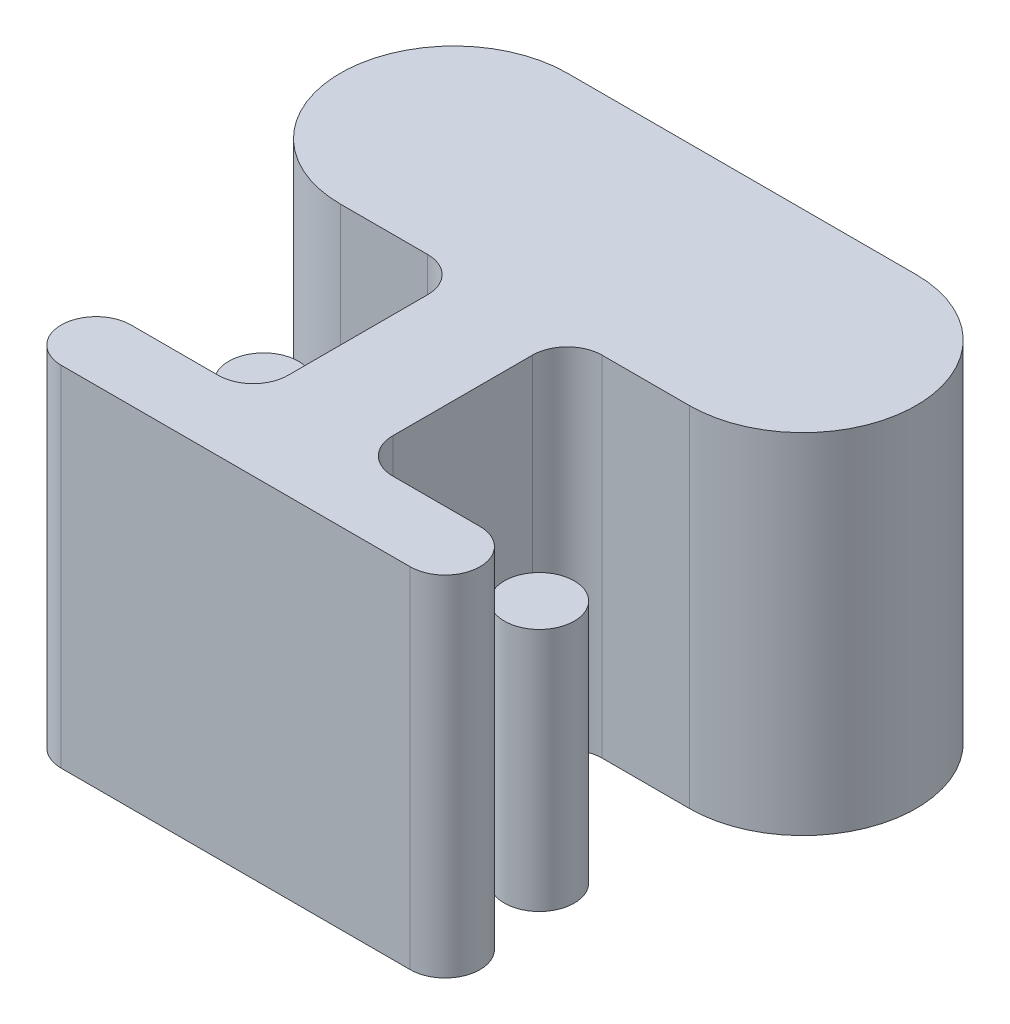
ISO-10303-21;
HEADER;
FILE_DESCRIPTION(('STEP AP214'),'2;1');
FILE_NAME('part.step','',(''),(''),'','','');
FILE_SCHEMA(('AUTOMOTIVE_DESIGN { 1 0 10303 214 1 1 1 1 }'));
ENDSEC;
DATA;
#1=APPLICATION_CONTEXT('core data for automotive mechanical design processes');
#2=APPLICATION_PROTOCOL_DEFINITION('international standard','automotive_design',2000,#1);
#3=PRODUCT_CONTEXT('',#1,'mechanical');
#4=PRODUCT('Part','Part','',(#3));
#5=PRODUCT_RELATED_PRODUCT_CATEGORY('part','',(#4));
#6=PRODUCT_DEFINITION_FORMATION('','',#4);
#7=PRODUCT_DEFINITION_CONTEXT('part definition',#1,'design');
#8=PRODUCT_DEFINITION('design','',#6,#7);
#9=PRODUCT_DEFINITION_SHAPE('','',#8);
#10=(LENGTH_UNIT() NAMED_UNIT(*) SI_UNIT(.MILLI.,.METRE.));
#11=(NAMED_UNIT(*) PLANE_ANGLE_UNIT() SI_UNIT($,.RADIAN.));
#12=(NAMED_UNIT(*) SI_UNIT($,.STERADIAN.) SOLID_ANGLE_UNIT());
#13=UNCERTAINTY_MEASURE_WITH_UNIT(LENGTH_MEASURE(1.E-05),#10,'distance_accuracy_value','');
#14=(GEOMETRIC_REPRESENTATION_CONTEXT(3) GLOBAL_UNCERTAINTY_ASSIGNED_CONTEXT((#13)) GLOBAL_UNIT_ASSIGNED_CONTEXT((#10,
#11,#12)) REPRESENTATION_CONTEXT('',''));
#15=CARTESIAN_POINT('',(0.,0.,0.));
#16=DIRECTION('',(0.,0.,1.));
#17=DIRECTION('',(1.,0.,0.));
#18=AXIS2_PLACEMENT_3D('',#15,#16,#17);
#19=CARTESIAN_POINT('',(-470.,700.,575.));
#20=DIRECTION('',(0.,-1.,0.));
#21=DIRECTION('',(0.,0.,-1.));
#22=AXIS2_PLACEMENT_3D('',#19,#20,#21);
#23=CYLINDRICAL_SURFACE('',#22,100.);
#24=CARTESIAN_POINT('',(-470.,700.,575.));
#25=DIRECTION('',(0.,-1.,0.));
#26=DIRECTION('',(0.,0.,-1.));
#27=AXIS2_PLACEMENT_3D('',#24,#25,#26);
#28=CIRCLE('',#27,100.);
#29=CARTESIAN_POINT('',(-470.,700.,475.));
#30=VERTEX_POINT('',#29);
#31=EDGE_CURVE('E53',#30,#30,#28,.T.);
#32=ORIENTED_EDGE('',*,*,#31,.T.);
#33=EDGE_LOOP('',(#32));
#34=FACE_BOUND('',#33,.T.);
#35=CARTESIAN_POINT('',(-470.,0.,575.));
#36=DIRECTION('',(0.,-1.,0.));
#37=DIRECTION('',(0.,0.,-1.));
#38=AXIS2_PLACEMENT_3D('',#35,#36,#37);
#39=CIRCLE('',#38,100.);
#40=CARTESIAN_POINT('',(-470.,0.,475.));
#41=VERTEX_POINT('',#40);
#42=EDGE_CURVE('E11',#41,#41,#39,.T.);
#43=ORIENTED_EDGE('',*,*,#42,.F.);
#44=EDGE_LOOP('',(#43));
#45=FACE_BOUND('',#44,.T.);
#46=ADVANCED_FACE('F49',(#34,#45),#23,.T.);
#47=CARTESIAN_POINT('',(-470.,700.,575.));
#48=DIRECTION('',(0.,-1.,0.));
#49=DIRECTION('',(0.,0.,-1.));
#50=AXIS2_PLACEMENT_3D('',#47,#48,#49);
#51=PLANE('',#50);
#52=ORIENTED_EDGE('',*,*,#31,.F.);
#53=EDGE_LOOP('',(#52));
#54=FACE_BOUND('',#53,.T.);
#55=ADVANCED_FACE('F51',(#54),#51,.F.);
#56=CARTESIAN_POINT('',(-470.,0.,575.));
#57=DIRECTION('',(0.,-1.,0.));
#58=DIRECTION('',(0.,0.,-1.));
#59=AXIS2_PLACEMENT_3D('',#56,#57,#58);
#60=PLANE('',#59);
#61=ORIENTED_EDGE('',*,*,#42,.T.);
#62=EDGE_LOOP('',(#61));
#63=FACE_BOUND('',#62,.T.);
#64=ADVANCED_FACE('F65',(#63),#60,.T.);
#65=CLOSED_SHELL('',(#46,#55,#64));
#66=MANIFOLD_SOLID_BREP('B2',#65);
#67=CARTESIAN_POINT('',(470.,700.,725.));
#68=DIRECTION('',(0.,-1.,0.));
#69=DIRECTION('',(0.,0.,-1.));
#70=AXIS2_PLACEMENT_3D('',#67,#68,#69);
#71=CYLINDRICAL_SURFACE('',#70,100.);
#72=CARTESIAN_POINT('',(470.,700.,725.));
#73=DIRECTION('',(0.,-1.,0.));
#74=DIRECTION('',(0.,0.,-1.));
#75=AXIS2_PLACEMENT_3D('',#72,#73,#74);
#76=CIRCLE('',#75,100.);
#77=CARTESIAN_POINT('',(470.,700.,625.));
#78=VERTEX_POINT('',#77);
#79=EDGE_CURVE('E48',#78,#78,#76,.T.);
#80=ORIENTED_EDGE('',*,*,#79,.T.);
#81=EDGE_LOOP('',(#80));
#82=FACE_BOUND('',#81,.T.);
#83=CARTESIAN_POINT('',(470.,0.,725.));
#84=DIRECTION('',(0.,-1.,0.));
#85=DIRECTION('',(0.,0.,-1.));
#86=AXIS2_PLACEMENT_3D('',#83,#84,#85);
#87=CIRCLE('',#86,100.);
#88=CARTESIAN_POINT('',(470.,0.,625.));
#89=VERTEX_POINT('',#88);
#90=EDGE_CURVE('E107',#89,#89,#87,.T.);
#91=ORIENTED_EDGE('',*,*,#90,.F.);
#92=EDGE_LOOP('',(#91));
#93=FACE_BOUND('',#92,.T.);
#94=ADVANCED_FACE('F104',(#82,#93),#71,.T.);
#95=CARTESIAN_POINT('',(0.,700.,0.));
#96=DIRECTION('',(0.,-1.,0.));
#97=DIRECTION('',(0.,0.,-1.));
#98=AXIS2_PLACEMENT_3D('',#95,#96,#97);
#99=PLANE('',#98);
#100=ORIENTED_EDGE('',*,*,#79,.F.);
#101=EDGE_LOOP('',(#100));
#102=FACE_BOUND('',#101,.T.);
#103=ADVANCED_FACE('F119',(#102),#99,.F.);
#104=CARTESIAN_POINT('',(0.,0.,0.));
#105=DIRECTION('',(0.,-1.,0.));
#106=DIRECTION('',(0.,0.,-1.));
#107=AXIS2_PLACEMENT_3D('',#104,#105,#106);
#108=PLANE('',#107);
#109=ORIENTED_EDGE('',*,*,#90,.T.);
#110=EDGE_LOOP('',(#109));
#111=FACE_BOUND('',#110,.T.);
#112=ADVANCED_FACE('F116',(#111),#108,.T.);
#113=CLOSED_SHELL('',(#94,#103,#112));
#114=MANIFOLD_SOLID_BREP('B6',#113);
#115=CARTESIAN_POINT('',(500.,1000.,0.));
#116=DIRECTION('',(0.,-1.,0.));
#117=DIRECTION('',(0.,0.,-1.));
#118=AXIS2_PLACEMENT_3D('',#115,#116,#117);
#119=CYLINDRICAL_SURFACE('',#118,325.);
#120=CARTESIAN_POINT('',(500.,0.,0.));
#121=DIRECTION('',(0.,1.,0.));
#122=DIRECTION('',(0.,0.,1.));
#123=AXIS2_PLACEMENT_3D('',#120,#121,#122);
#124=CIRCLE('',#123,325.);
#125=CARTESIAN_POINT('',(500.,0.,325.));
#126=VERTEX_POINT('',#125);
#127=CARTESIAN_POINT('',(500.,0.,-325.));
#128=VERTEX_POINT('',#127);
#129=EDGE_CURVE('E286',#126,#128,#124,.T.);
#130=ORIENTED_EDGE('',*,*,#129,.T.);
#131=DIRECTION('',(0.,-1.,0.));
#132=VECTOR('',#131,1.);
#133=CARTESIAN_POINT('',(500.,1000.,-325.));
#134=LINE('',#133,#132);
#135=CARTESIAN_POINT('',(500.,1000.,-325.));
#136=VERTEX_POINT('',#135);
#137=EDGE_CURVE('E267',#136,#128,#134,.T.);
#138=ORIENTED_EDGE('',*,*,#137,.F.);
#139=CARTESIAN_POINT('',(500.,1000.,0.));
#140=DIRECTION('',(0.,1.,0.));
#141=DIRECTION('',(0.,0.,1.));
#142=AXIS2_PLACEMENT_3D('',#139,#140,#141);
#143=CIRCLE('',#142,325.);
#144=CARTESIAN_POINT('',(500.,1000.,325.));
#145=VERTEX_POINT('',#144);
#146=EDGE_CURVE('E274',#145,#136,#143,.T.);
#147=ORIENTED_EDGE('',*,*,#146,.F.);
#148=DIRECTION('',(0.,-1.,0.));
#149=VECTOR('',#148,1.);
#150=CARTESIAN_POINT('',(500.,1000.,325.));
#151=LINE('',#150,#149);
#152=EDGE_CURVE('E354',#145,#126,#151,.T.);
#153=ORIENTED_EDGE('',*,*,#152,.T.);
#154=EDGE_LOOP('',(#130,#138,#147,#153));
#155=FACE_BOUND('',#154,.T.);
#156=ADVANCED_FACE('F150',(#155),#119,.T.);
#157=CARTESIAN_POINT('',(-500.,1000.,-325.));
#158=DIRECTION('',(0.,0.,1.));
#159=DIRECTION('',(1.,0.,0.));
#160=AXIS2_PLACEMENT_3D('',#157,#158,#159);
#161=PLANE('',#160);
#162=DIRECTION('',(-1.,0.,0.));
#163=VECTOR('',#162,1.);
#164=CARTESIAN_POINT('',(-500.,0.,-325.));
#165=LINE('',#164,#163);
#166=CARTESIAN_POINT('',(-500.,0.,-325.));
#167=VERTEX_POINT('',#166);
#168=EDGE_CURVE('E368',#128,#167,#165,.T.);
#169=ORIENTED_EDGE('',*,*,#168,.T.);
#170=DIRECTION('',(0.,-1.,0.));
#171=VECTOR('',#170,1.);
#172=CARTESIAN_POINT('',(-500.,1000.,-325.));
#173=LINE('',#172,#171);
#174=CARTESIAN_POINT('',(-500.,1000.,-325.));
#175=VERTEX_POINT('',#174);
#176=EDGE_CURVE('E270',#175,#167,#173,.T.);
#177=ORIENTED_EDGE('',*,*,#176,.F.);
#178=DIRECTION('',(-1.,0.,0.));
#179=VECTOR('',#178,1.);
#180=CARTESIAN_POINT('',(-500.,1000.,-325.));
#181=LINE('',#180,#179);
#182=EDGE_CURVE('E263',#136,#175,#181,.T.);
#183=ORIENTED_EDGE('',*,*,#182,.F.);
#184=ORIENTED_EDGE('',*,*,#137,.T.);
#185=EDGE_LOOP('',(#169,#177,#183,#184));
#186=FACE_BOUND('',#185,.T.);
#187=ADVANCED_FACE('F265',(#186),#161,.F.);
#188=CARTESIAN_POINT('',(-500.,1000.,0.));
#189=DIRECTION('',(0.,-1.,0.));
#190=DIRECTION('',(0.,0.,-1.));
#191=AXIS2_PLACEMENT_3D('',#188,#189,#190);
#192=CYLINDRICAL_SURFACE('',#191,325.);
#193=CARTESIAN_POINT('',(-500.,0.,0.));
#194=DIRECTION('',(0.,1.,0.));
#195=DIRECTION('',(0.,0.,-1.));
#196=AXIS2_PLACEMENT_3D('',#193,#194,#195);
#197=CIRCLE('',#196,325.);
#198=CARTESIAN_POINT('',(-500.,0.,325.));
#199=VERTEX_POINT('',#198);
#200=EDGE_CURVE('E371',#167,#199,#197,.T.);
#201=ORIENTED_EDGE('',*,*,#200,.T.);
#202=DIRECTION('',(0.,-1.,0.));
#203=VECTOR('',#202,1.);
#204=CARTESIAN_POINT('',(-500.,1000.,325.));
#205=LINE('',#204,#203);
#206=CARTESIAN_POINT('',(-500.,1000.,325.));
#207=VERTEX_POINT('',#206);
#208=EDGE_CURVE('E294',#207,#199,#205,.T.);
#209=ORIENTED_EDGE('',*,*,#208,.F.);
#210=CARTESIAN_POINT('',(-500.,1000.,0.));
#211=DIRECTION('',(0.,1.,0.));
#212=DIRECTION('',(0.,0.,-1.));
#213=AXIS2_PLACEMENT_3D('',#210,#211,#212);
#214=CIRCLE('',#213,325.);
#215=EDGE_CURVE('E273',#175,#207,#214,.T.);
#216=ORIENTED_EDGE('',*,*,#215,.F.);
#217=ORIENTED_EDGE('',*,*,#176,.T.);
#218=EDGE_LOOP('',(#201,#209,#216,#217));
#219=FACE_BOUND('',#218,.T.);
#220=ADVANCED_FACE('F499',(#219),#192,.T.);
#221=CARTESIAN_POINT('',(-500.,1000.,325.));
#222=DIRECTION('',(0.,0.,-1.));
#223=DIRECTION('',(-1.,0.,0.));
#224=AXIS2_PLACEMENT_3D('',#221,#222,#223);
#225=PLANE('',#224);
#226=DIRECTION('',(1.,0.,0.));
#227=VECTOR('',#226,1.);
#228=CARTESIAN_POINT('',(-500.,0.,325.));
#229=LINE('',#228,#227);
#230=CARTESIAN_POINT('',(-250.,0.,325.));
#231=VERTEX_POINT('',#230);
#232=EDGE_CURVE('E374',#199,#231,#229,.T.);
#233=ORIENTED_EDGE('',*,*,#232,.T.);
#234=DIRECTION('',(0.,-1.,0.));
#235=VECTOR('',#234,1.);
#236=CARTESIAN_POINT('',(-250.,1000.,325.));
#237=LINE('',#236,#235);
#238=CARTESIAN_POINT('',(-250.,1000.,325.));
#239=VERTEX_POINT('',#238);
#240=EDGE_CURVE('E315',#231,#239,#237,.F.);
#241=ORIENTED_EDGE('',*,*,#240,.T.);
#242=DIRECTION('',(1.,0.,0.));
#243=VECTOR('',#242,1.);
#244=CARTESIAN_POINT('',(-500.,1000.,325.));
#245=LINE('',#244,#243);
#246=EDGE_CURVE('E422',#207,#239,#245,.T.);
#247=ORIENTED_EDGE('',*,*,#246,.F.);
#248=ORIENTED_EDGE('',*,*,#208,.T.);
#249=EDGE_LOOP('',(#233,#241,#247,#248));
#250=FACE_BOUND('',#249,.T.);
#251=ADVANCED_FACE('F419',(#250),#225,.F.);
#252=CARTESIAN_POINT('',(-150.,1000.,925.));
#253=DIRECTION('',(1.,0.,0.));
#254=DIRECTION('',(0.,0.,-1.));
#255=AXIS2_PLACEMENT_3D('',#252,#253,#254);
#256=PLANE('',#255);
#257=DIRECTION('',(0.,0.,1.));
#258=VECTOR('',#257,1.);
#259=CARTESIAN_POINT('',(-150.,0.,925.));
#260=LINE('',#259,#258);
#261=CARTESIAN_POINT('',(-150.,0.,425.));
#262=VERTEX_POINT('',#261);
#263=CARTESIAN_POINT('',(-150.,0.,825.));
#264=VERTEX_POINT('',#263);
#265=EDGE_CURVE('E378',#262,#264,#260,.T.);
#266=ORIENTED_EDGE('',*,*,#265,.T.);
#267=DIRECTION('',(0.,-1.,0.));
#268=VECTOR('',#267,1.);
#269=CARTESIAN_POINT('',(-150.,1000.,825.));
#270=LINE('',#269,#268);
#271=CARTESIAN_POINT('',(-150.,1000.,825.));
#272=VERTEX_POINT('',#271);
#273=EDGE_CURVE('E312',#264,#272,#270,.F.);
#274=ORIENTED_EDGE('',*,*,#273,.T.);
#275=DIRECTION('',(0.,0.,1.));
#276=VECTOR('',#275,1.);
#277=CARTESIAN_POINT('',(-150.,1000.,925.));
#278=LINE('',#277,#276);
#279=CARTESIAN_POINT('',(-150.,1000.,425.));
#280=VERTEX_POINT('',#279);
#281=EDGE_CURVE('E435',#280,#272,#278,.T.);
#282=ORIENTED_EDGE('',*,*,#281,.F.);
#283=DIRECTION('',(0.,-1.,0.));
#284=VECTOR('',#283,1.);
#285=CARTESIAN_POINT('',(-150.,0.,425.));
#286=LINE('',#285,#284);
#287=EDGE_CURVE('E308',#280,#262,#286,.T.);
#288=ORIENTED_EDGE('',*,*,#287,.T.);
#289=EDGE_LOOP('',(#266,#274,#282,#288));
#290=FACE_BOUND('',#289,.T.);
#291=ADVANCED_FACE('F432',(#290),#256,.F.);
#292=CARTESIAN_POINT('',(-500.,1000.,925.));
#293=DIRECTION('',(0.,0.,1.));
#294=DIRECTION('',(1.,0.,0.));
#295=AXIS2_PLACEMENT_3D('',#292,#293,#294);
#296=PLANE('',#295);
#297=DIRECTION('',(-1.,0.,0.));
#298=VECTOR('',#297,1.);
#299=CARTESIAN_POINT('',(-500.,1000.,925.));
#300=LINE('',#299,#298);
#301=CARTESIAN_POINT('',(-250.,1000.,925.));
#302=VERTEX_POINT('',#301);
#303=CARTESIAN_POINT('',(-500.,1000.,925.));
#304=VERTEX_POINT('',#303);
#305=EDGE_CURVE('E438',#302,#304,#300,.T.);
#306=ORIENTED_EDGE('',*,*,#305,.F.);
#307=DIRECTION('',(0.,-1.,0.));
#308=VECTOR('',#307,1.);
#309=CARTESIAN_POINT('',(-250.,0.,925.));
#310=LINE('',#309,#308);
#311=CARTESIAN_POINT('',(-250.,0.,925.));
#312=VERTEX_POINT('',#311);
#313=EDGE_CURVE('E304',#302,#312,#310,.T.);
#314=ORIENTED_EDGE('',*,*,#313,.T.);
#315=DIRECTION('',(-1.,0.,0.));
#316=VECTOR('',#315,1.);
#317=CARTESIAN_POINT('',(-500.,0.,925.));
#318=LINE('',#317,#316);
#319=CARTESIAN_POINT('',(-500.,0.,925.));
#320=VERTEX_POINT('',#319);
#321=EDGE_CURVE('E382',#312,#320,#318,.T.);
#322=ORIENTED_EDGE('',*,*,#321,.T.);
#323=DIRECTION('',(0.,-1.,0.));
#324=VECTOR('',#323,1.);
#325=CARTESIAN_POINT('',(-500.,1000.,925.));
#326=LINE('',#325,#324);
#327=EDGE_CURVE('E410',#304,#320,#326,.T.);
#328=ORIENTED_EDGE('',*,*,#327,.F.);
#329=EDGE_LOOP('',(#306,#314,#322,#328));
#330=FACE_BOUND('',#329,.T.);
#331=ADVANCED_FACE('F483',(#330),#296,.F.);
#332=CARTESIAN_POINT('',(-500.,1000.,1025.));
#333=DIRECTION('',(0.,-1.,0.));
#334=DIRECTION('',(0.,0.,-1.));
#335=AXIS2_PLACEMENT_3D('',#332,#333,#334);
#336=CYLINDRICAL_SURFACE('',#335,100.);
#337=CARTESIAN_POINT('',(-500.,0.,1025.));
#338=DIRECTION('',(0.,1.,0.));
#339=DIRECTION('',(0.,0.,-1.));
#340=AXIS2_PLACEMENT_3D('',#337,#338,#339);
#341=CIRCLE('',#340,100.);
#342=CARTESIAN_POINT('',(-500.,0.,1125.));
#343=VERTEX_POINT('',#342);
#344=EDGE_CURVE('E385',#320,#343,#341,.T.);
#345=ORIENTED_EDGE('',*,*,#344,.T.);
#346=DIRECTION('',(0.,-1.,0.));
#347=VECTOR('',#346,1.);
#348=CARTESIAN_POINT('',(-500.,1000.,1125.));
#349=LINE('',#348,#347);
#350=CARTESIAN_POINT('',(-500.,1000.,1125.));
#351=VERTEX_POINT('',#350);
#352=EDGE_CURVE('E406',#351,#343,#349,.T.);
#353=ORIENTED_EDGE('',*,*,#352,.F.);
#354=CARTESIAN_POINT('',(-500.,1000.,1025.));
#355=DIRECTION('',(0.,1.,0.));
#356=DIRECTION('',(0.,0.,-1.));
#357=AXIS2_PLACEMENT_3D('',#354,#355,#356);
#358=CIRCLE('',#357,100.);
#359=EDGE_CURVE('E442',#304,#351,#358,.T.);
#360=ORIENTED_EDGE('',*,*,#359,.F.);
#361=ORIENTED_EDGE('',*,*,#327,.T.);
#362=EDGE_LOOP('',(#345,#353,#360,#361));
#363=FACE_BOUND('',#362,.T.);
#364=ADVANCED_FACE('F479',(#363),#336,.T.);
#365=CARTESIAN_POINT('',(-500.,1000.,1125.));
#366=DIRECTION('',(0.,0.,-1.));
#367=DIRECTION('',(-1.,0.,0.));
#368=AXIS2_PLACEMENT_3D('',#365,#366,#367);
#369=PLANE('',#368);
#370=DIRECTION('',(1.,0.,0.));
#371=VECTOR('',#370,1.);
#372=CARTESIAN_POINT('',(-500.,0.,1125.));
#373=LINE('',#372,#371);
#374=CARTESIAN_POINT('',(500.,0.,1125.));
#375=VERTEX_POINT('',#374);
#376=EDGE_CURVE('E388',#343,#375,#373,.T.);
#377=ORIENTED_EDGE('',*,*,#376,.T.);
#378=DIRECTION('',(0.,-1.,0.));
#379=VECTOR('',#378,1.);
#380=CARTESIAN_POINT('',(500.,1000.,1125.));
#381=LINE('',#380,#379);
#382=CARTESIAN_POINT('',(500.,1000.,1125.));
#383=VERTEX_POINT('',#382);
#384=EDGE_CURVE('E402',#383,#375,#381,.T.);
#385=ORIENTED_EDGE('',*,*,#384,.F.);
#386=DIRECTION('',(1.,0.,0.));
#387=VECTOR('',#386,1.);
#388=CARTESIAN_POINT('',(-500.,1000.,1125.));
#389=LINE('',#388,#387);
#390=EDGE_CURVE('E449',#351,#383,#389,.T.);
#391=ORIENTED_EDGE('',*,*,#390,.F.);
#392=ORIENTED_EDGE('',*,*,#352,.T.);
#393=EDGE_LOOP('',(#377,#385,#391,#392));
#394=FACE_BOUND('',#393,.T.);
#395=ADVANCED_FACE('F474',(#394),#369,.F.);
#396=CARTESIAN_POINT('',(500.,1000.,1025.));
#397=DIRECTION('',(0.,-1.,0.));
#398=DIRECTION('',(0.,0.,-1.));
#399=AXIS2_PLACEMENT_3D('',#396,#397,#398);
#400=CYLINDRICAL_SURFACE('',#399,100.);
#401=CARTESIAN_POINT('',(500.,0.,1025.));
#402=DIRECTION('',(0.,1.,0.));
#403=DIRECTION('',(0.,0.,1.));
#404=AXIS2_PLACEMENT_3D('',#401,#402,#403);
#405=CIRCLE('',#404,100.);
#406=CARTESIAN_POINT('',(500.,0.,925.));
#407=VERTEX_POINT('',#406);
#408=EDGE_CURVE('E391',#375,#407,#405,.T.);
#409=ORIENTED_EDGE('',*,*,#408,.T.);
#410=DIRECTION('',(0.,-1.,0.));
#411=VECTOR('',#410,1.);
#412=CARTESIAN_POINT('',(500.,1000.,925.));
#413=LINE('',#412,#411);
#414=CARTESIAN_POINT('',(500.,1000.,925.));
#415=VERTEX_POINT('',#414);
#416=EDGE_CURVE('E360',#415,#407,#413,.T.);
#417=ORIENTED_EDGE('',*,*,#416,.F.);
#418=CARTESIAN_POINT('',(500.,1000.,1025.));
#419=DIRECTION('',(0.,1.,0.));
#420=DIRECTION('',(0.,0.,1.));
#421=AXIS2_PLACEMENT_3D('',#418,#419,#420);
#422=CIRCLE('',#421,100.);
#423=EDGE_CURVE('E452',#383,#415,#422,.T.);
#424=ORIENTED_EDGE('',*,*,#423,.F.);
#425=ORIENTED_EDGE('',*,*,#384,.T.);
#426=EDGE_LOOP('',(#409,#417,#424,#425));
#427=FACE_BOUND('',#426,.T.);
#428=ADVANCED_FACE('F468',(#427),#400,.T.);
#429=CARTESIAN_POINT('',(150.,1000.,925.));
#430=DIRECTION('',(0.,0.,1.));
#431=DIRECTION('',(1.,0.,0.));
#432=AXIS2_PLACEMENT_3D('',#429,#430,#431);
#433=PLANE('',#432);
#434=DIRECTION('',(-1.,0.,0.));
#435=VECTOR('',#434,1.);
#436=CARTESIAN_POINT('',(150.,0.,925.));
#437=LINE('',#436,#435);
#438=CARTESIAN_POINT('',(250.,0.,925.));
#439=VERTEX_POINT('',#438);
#440=EDGE_CURVE('E350',#407,#439,#437,.T.);
#441=ORIENTED_EDGE('',*,*,#440,.T.);
#442=DIRECTION('',(0.,-1.,0.));
#443=VECTOR('',#442,1.);
#444=CARTESIAN_POINT('',(250.,1000.,925.));
#445=LINE('',#444,#443);
#446=CARTESIAN_POINT('',(250.,1000.,925.));
#447=VERTEX_POINT('',#446);
#448=EDGE_CURVE('E301',#439,#447,#445,.F.);
#449=ORIENTED_EDGE('',*,*,#448,.T.);
#450=DIRECTION('',(-1.,0.,0.));
#451=VECTOR('',#450,1.);
#452=CARTESIAN_POINT('',(150.,1000.,925.));
#453=LINE('',#452,#451);
#454=EDGE_CURVE('E362',#415,#447,#453,.T.);
#455=ORIENTED_EDGE('',*,*,#454,.F.);
#456=ORIENTED_EDGE('',*,*,#416,.T.);
#457=EDGE_LOOP('',(#441,#449,#455,#456));
#458=FACE_BOUND('',#457,.T.);
#459=ADVANCED_FACE('F466',(#458),#433,.F.);
#460=CARTESIAN_POINT('',(150.,1000.,925.));
#461=DIRECTION('',(-1.,0.,0.));
#462=DIRECTION('',(0.,0.,1.));
#463=AXIS2_PLACEMENT_3D('',#460,#461,#462);
#464=PLANE('',#463);
#465=DIRECTION('',(0.,0.,-1.));
#466=VECTOR('',#465,1.);
#467=CARTESIAN_POINT('',(150.,1000.,925.));
#468=LINE('',#467,#466);
#469=CARTESIAN_POINT('',(150.,1000.,825.));
#470=VERTEX_POINT('',#469);
#471=CARTESIAN_POINT('',(150.,1000.,425.));
#472=VERTEX_POINT('',#471);
#473=EDGE_CURVE('E356',#470,#472,#468,.T.);
#474=ORIENTED_EDGE('',*,*,#473,.F.);
#475=DIRECTION('',(0.,-1.,0.));
#476=VECTOR('',#475,1.);
#477=CARTESIAN_POINT('',(150.,0.,825.));
#478=LINE('',#477,#476);
#479=CARTESIAN_POINT('',(150.,0.,825.));
#480=VERTEX_POINT('',#479);
#481=EDGE_CURVE('E292',#470,#480,#478,.T.);
#482=ORIENTED_EDGE('',*,*,#481,.T.);
#483=DIRECTION('',(0.,0.,-1.));
#484=VECTOR('',#483,1.);
#485=CARTESIAN_POINT('',(150.,0.,925.));
#486=LINE('',#485,#484);
#487=CARTESIAN_POINT('',(150.,0.,425.));
#488=VERTEX_POINT('',#487);
#489=EDGE_CURVE('E344',#480,#488,#486,.T.);
#490=ORIENTED_EDGE('',*,*,#489,.T.);
#491=DIRECTION('',(0.,-1.,0.));
#492=VECTOR('',#491,1.);
#493=CARTESIAN_POINT('',(150.,1000.,425.));
#494=LINE('',#493,#492);
#495=EDGE_CURVE('E288',#488,#472,#494,.F.);
#496=ORIENTED_EDGE('',*,*,#495,.T.);
#497=EDGE_LOOP('',(#474,#482,#490,#496));
#498=FACE_BOUND('',#497,.T.);
#499=ADVANCED_FACE('F347',(#498),#464,.F.);
#500=CARTESIAN_POINT('',(150.,1000.,325.));
#501=DIRECTION('',(0.,0.,-1.));
#502=DIRECTION('',(-1.,0.,0.));
#503=AXIS2_PLACEMENT_3D('',#500,#501,#502);
#504=PLANE('',#503);
#505=DIRECTION('',(1.,0.,0.));
#506=VECTOR('',#505,1.);
#507=CARTESIAN_POINT('',(150.,1000.,325.));
#508=LINE('',#507,#506);
#509=CARTESIAN_POINT('',(250.,1000.,325.));
#510=VERTEX_POINT('',#509);
#511=EDGE_CURVE('E278',#510,#145,#508,.T.);
#512=ORIENTED_EDGE('',*,*,#511,.F.);
#513=DIRECTION('',(0.,-1.,0.));
#514=VECTOR('',#513,1.);
#515=CARTESIAN_POINT('',(250.,0.,325.));
#516=LINE('',#515,#514);
#517=CARTESIAN_POINT('',(250.,0.,325.));
#518=VERTEX_POINT('',#517);
#519=EDGE_CURVE('E318',#510,#518,#516,.T.);
#520=ORIENTED_EDGE('',*,*,#519,.T.);
#521=DIRECTION('',(1.,0.,0.));
#522=VECTOR('',#521,1.);
#523=CARTESIAN_POINT('',(150.,0.,325.));
#524=LINE('',#523,#522);
#525=EDGE_CURVE('E283',#518,#126,#524,.T.);
#526=ORIENTED_EDGE('',*,*,#525,.T.);
#527=ORIENTED_EDGE('',*,*,#152,.F.);
#528=EDGE_LOOP('',(#512,#520,#526,#527));
#529=FACE_BOUND('',#528,.T.);
#530=ADVANCED_FACE('F353',(#529),#504,.F.);
#531=CARTESIAN_POINT('',(500.,1000.,0.));
#532=DIRECTION('',(0.,1.,0.));
#533=DIRECTION('',(0.,0.,1.));
#534=AXIS2_PLACEMENT_3D('',#531,#532,#533);
#535=PLANE('',#534);
#536=ORIENTED_EDGE('',*,*,#146,.T.);
#537=ORIENTED_EDGE('',*,*,#182,.T.);
#538=ORIENTED_EDGE('',*,*,#215,.T.);
#539=ORIENTED_EDGE('',*,*,#246,.T.);
#540=CARTESIAN_POINT('',(-250.,1000.,425.));
#541=DIRECTION('',(0.,1.,0.));
#542=DIRECTION('',(0.,0.,1.));
#543=AXIS2_PLACEMENT_3D('',#540,#541,#542);
#544=CIRCLE('',#543,100.);
#545=EDGE_CURVE('E336',#239,#280,#544,.F.);
#546=ORIENTED_EDGE('',*,*,#545,.T.);
#547=ORIENTED_EDGE('',*,*,#281,.T.);
#548=CARTESIAN_POINT('',(-250.,1000.,825.));
#549=DIRECTION('',(0.,1.,0.));
#550=DIRECTION('',(0.,0.,1.));
#551=AXIS2_PLACEMENT_3D('',#548,#549,#550);
#552=CIRCLE('',#551,100.);
#553=EDGE_CURVE('E330',#272,#302,#552,.F.);
#554=ORIENTED_EDGE('',*,*,#553,.T.);
#555=ORIENTED_EDGE('',*,*,#305,.T.);
#556=ORIENTED_EDGE('',*,*,#359,.T.);
#557=ORIENTED_EDGE('',*,*,#390,.T.);
#558=ORIENTED_EDGE('',*,*,#423,.T.);
#559=ORIENTED_EDGE('',*,*,#454,.T.);
#560=CARTESIAN_POINT('',(250.,1000.,825.));
#561=DIRECTION('',(0.,1.,0.));
#562=DIRECTION('',(0.,0.,1.));
#563=AXIS2_PLACEMENT_3D('',#560,#561,#562);
#564=CIRCLE('',#563,100.);
#565=EDGE_CURVE('E324',#447,#470,#564,.F.);
#566=ORIENTED_EDGE('',*,*,#565,.T.);
#567=ORIENTED_EDGE('',*,*,#473,.T.);
#568=CARTESIAN_POINT('',(250.,1000.,425.));
#569=DIRECTION('',(0.,1.,0.));
#570=DIRECTION('',(0.,0.,1.));
#571=AXIS2_PLACEMENT_3D('',#568,#569,#570);
#572=CIRCLE('',#571,100.);
#573=EDGE_CURVE('E102',#472,#510,#572,.F.);
#574=ORIENTED_EDGE('',*,*,#573,.T.);
#575=ORIENTED_EDGE('',*,*,#511,.T.);
#576=EDGE_LOOP('',(#536,#537,#538,#539,#546,#547,#554,#555,#556,#557,#558,#559,#566,#567,#574,#575));
#577=FACE_BOUND('',#576,.T.);
#578=ADVANCED_FACE('F277',(#577),#535,.T.);
#579=CARTESIAN_POINT('',(500.,0.,0.));
#580=DIRECTION('',(0.,1.,0.));
#581=DIRECTION('',(0.,0.,1.));
#582=AXIS2_PLACEMENT_3D('',#579,#580,#581);
#583=PLANE('',#582);
#584=ORIENTED_EDGE('',*,*,#129,.F.);
#585=ORIENTED_EDGE('',*,*,#525,.F.);
#586=CARTESIAN_POINT('',(250.,0.,425.));
#587=DIRECTION('',(0.,1.,0.));
#588=DIRECTION('',(0.,0.,1.));
#589=AXIS2_PLACEMENT_3D('',#586,#587,#588);
#590=CIRCLE('',#589,100.);
#591=EDGE_CURVE('E159',#518,#488,#590,.T.);
#592=ORIENTED_EDGE('',*,*,#591,.T.);
#593=ORIENTED_EDGE('',*,*,#489,.F.);
#594=CARTESIAN_POINT('',(250.,0.,825.));
#595=DIRECTION('',(0.,1.,0.));
#596=DIRECTION('',(0.,0.,1.));
#597=AXIS2_PLACEMENT_3D('',#594,#595,#596);
#598=CIRCLE('',#597,100.);
#599=EDGE_CURVE('E321',#480,#439,#598,.T.);
#600=ORIENTED_EDGE('',*,*,#599,.T.);
#601=ORIENTED_EDGE('',*,*,#440,.F.);
#602=ORIENTED_EDGE('',*,*,#408,.F.);
#603=ORIENTED_EDGE('',*,*,#376,.F.);
#604=ORIENTED_EDGE('',*,*,#344,.F.);
#605=ORIENTED_EDGE('',*,*,#321,.F.);
#606=CARTESIAN_POINT('',(-250.,0.,825.));
#607=DIRECTION('',(0.,1.,0.));
#608=DIRECTION('',(0.,0.,1.));
#609=AXIS2_PLACEMENT_3D('',#606,#607,#608);
#610=CIRCLE('',#609,100.);
#611=EDGE_CURVE('E327',#312,#264,#610,.T.);
#612=ORIENTED_EDGE('',*,*,#611,.T.);
#613=ORIENTED_EDGE('',*,*,#265,.F.);
#614=CARTESIAN_POINT('',(-250.,0.,425.));
#615=DIRECTION('',(0.,1.,0.));
#616=DIRECTION('',(0.,0.,1.));
#617=AXIS2_PLACEMENT_3D('',#614,#615,#616);
#618=CIRCLE('',#617,100.);
#619=EDGE_CURVE('E333',#262,#231,#618,.T.);
#620=ORIENTED_EDGE('',*,*,#619,.T.);
#621=ORIENTED_EDGE('',*,*,#232,.F.);
#622=ORIENTED_EDGE('',*,*,#200,.F.);
#623=ORIENTED_EDGE('',*,*,#168,.F.);
#624=EDGE_LOOP('',(#584,#585,#592,#593,#600,#601,#602,#603,#604,#605,#612,#613,#620,#621,#622,#623));
#625=FACE_BOUND('',#624,.T.);
#626=ADVANCED_FACE('F343',(#625),#583,.F.);
#627=CARTESIAN_POINT('',(250.,1000.,825.));
#628=DIRECTION('',(0.,1.,0.));
#629=DIRECTION('',(0.,0.,1.));
#630=AXIS2_PLACEMENT_3D('',#627,#628,#629);
#631=CYLINDRICAL_SURFACE('',#630,100.);
#632=ORIENTED_EDGE('',*,*,#565,.F.);
#633=ORIENTED_EDGE('',*,*,#448,.F.);
#634=ORIENTED_EDGE('',*,*,#599,.F.);
#635=ORIENTED_EDGE('',*,*,#481,.F.);
#636=EDGE_LOOP('',(#632,#633,#634,#635));
#637=FACE_BOUND('',#636,.T.);
#638=ADVANCED_FACE('F463',(#637),#631,.F.);
#639=CARTESIAN_POINT('',(-250.,1000.,825.));
#640=DIRECTION('',(0.,1.,0.));
#641=DIRECTION('',(0.,0.,1.));
#642=AXIS2_PLACEMENT_3D('',#639,#640,#641);
#643=CYLINDRICAL_SURFACE('',#642,100.);
#644=ORIENTED_EDGE('',*,*,#553,.F.);
#645=ORIENTED_EDGE('',*,*,#273,.F.);
#646=ORIENTED_EDGE('',*,*,#611,.F.);
#647=ORIENTED_EDGE('',*,*,#313,.F.);
#648=EDGE_LOOP('',(#644,#645,#646,#647));
#649=FACE_BOUND('',#648,.T.);
#650=ADVANCED_FACE('F486',(#649),#643,.F.);
#651=CARTESIAN_POINT('',(-250.,1000.,425.));
#652=DIRECTION('',(0.,1.,0.));
#653=DIRECTION('',(0.,0.,1.));
#654=AXIS2_PLACEMENT_3D('',#651,#652,#653);
#655=CYLINDRICAL_SURFACE('',#654,100.);
#656=ORIENTED_EDGE('',*,*,#545,.F.);
#657=ORIENTED_EDGE('',*,*,#240,.F.);
#658=ORIENTED_EDGE('',*,*,#619,.F.);
#659=ORIENTED_EDGE('',*,*,#287,.F.);
#660=EDGE_LOOP('',(#656,#657,#658,#659));
#661=FACE_BOUND('',#660,.T.);
#662=ADVANCED_FACE('F429',(#661),#655,.F.);
#663=CARTESIAN_POINT('',(250.,1000.,425.));
#664=DIRECTION('',(0.,1.,0.));
#665=DIRECTION('',(0.,0.,1.));
#666=AXIS2_PLACEMENT_3D('',#663,#664,#665);
#667=CYLINDRICAL_SURFACE('',#666,100.);
#668=ORIENTED_EDGE('',*,*,#573,.F.);
#669=ORIENTED_EDGE('',*,*,#495,.F.);
#670=ORIENTED_EDGE('',*,*,#591,.F.);
#671=ORIENTED_EDGE('',*,*,#519,.F.);
#672=EDGE_LOOP('',(#668,#669,#670,#671));
#673=FACE_BOUND('',#672,.T.);
#674=ADVANCED_FACE('F152',(#673),#667,.F.);
#675=CLOSED_SHELL('',(#156,#187,#220,#251,#291,#331,#364,#395,#428,#459,#499,#530,#578,#626,
#638,#650,#662,#674));
#676=MANIFOLD_SOLID_BREP('B43',#675);
#677=ADVANCED_BREP_SHAPE_REPRESENTATION('',(#18,#66,#114,#676),#14);
#678=SHAPE_DEFINITION_REPRESENTATION(#9,#677);
ENDSEC;
END-ISO-10303-21;
